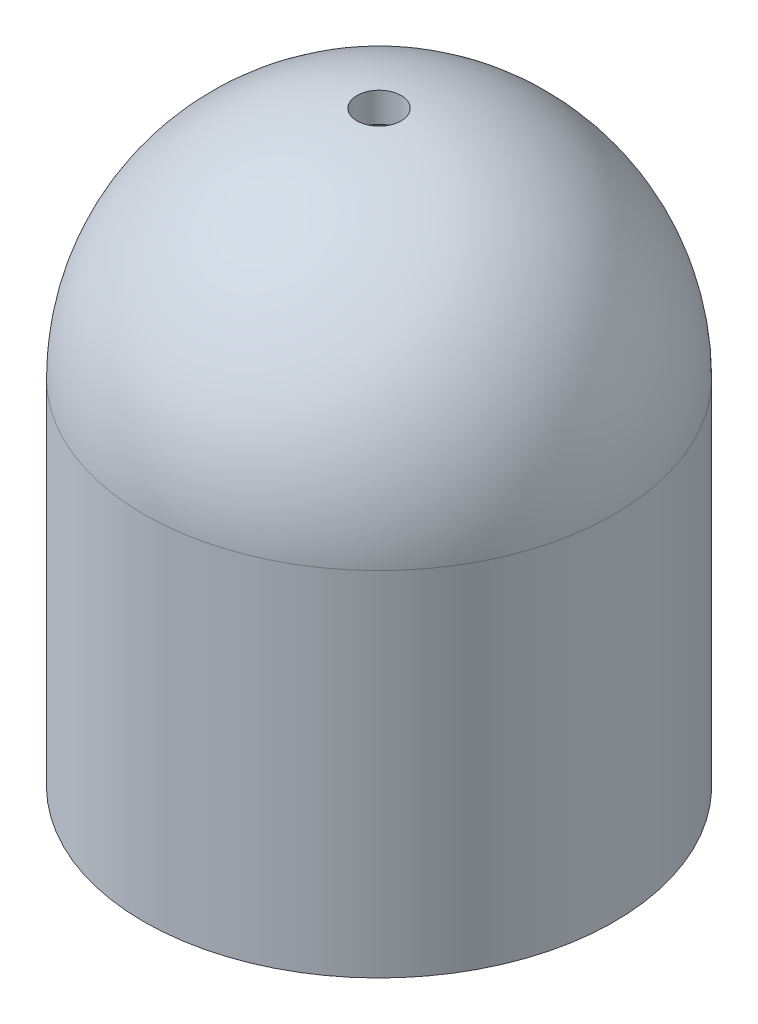
ISO-10303-21;
HEADER;
FILE_DESCRIPTION(('STEP AP214'),'2;1');
FILE_NAME('part.step','',(''),(''),'','','');
FILE_SCHEMA(('AUTOMOTIVE_DESIGN { 1 0 10303 214 1 1 1 1 }'));
ENDSEC;
DATA;
#1=APPLICATION_CONTEXT('core data for automotive mechanical design processes');
#2=APPLICATION_PROTOCOL_DEFINITION('international standard','automotive_design',2000,#1);
#3=PRODUCT_CONTEXT('',#1,'mechanical');
#4=PRODUCT('Part','Part','',(#3));
#5=PRODUCT_RELATED_PRODUCT_CATEGORY('part','',(#4));
#6=PRODUCT_DEFINITION_FORMATION('','',#4);
#7=PRODUCT_DEFINITION_CONTEXT('part definition',#1,'design');
#8=PRODUCT_DEFINITION('design','',#6,#7);
#9=PRODUCT_DEFINITION_SHAPE('','',#8);
#10=(LENGTH_UNIT() NAMED_UNIT(*) SI_UNIT(.MILLI.,.METRE.));
#11=(NAMED_UNIT(*) PLANE_ANGLE_UNIT() SI_UNIT($,.RADIAN.));
#12=(NAMED_UNIT(*) SI_UNIT($,.STERADIAN.) SOLID_ANGLE_UNIT());
#13=UNCERTAINTY_MEASURE_WITH_UNIT(LENGTH_MEASURE(1.E-05),#10,'distance_accuracy_value','');
#14=(GEOMETRIC_REPRESENTATION_CONTEXT(3) GLOBAL_UNCERTAINTY_ASSIGNED_CONTEXT((#13)) GLOBAL_UNIT_ASSIGNED_CONTEXT((#10,
#11,#12)) REPRESENTATION_CONTEXT('',''));
#15=CARTESIAN_POINT('',(0.,0.,0.));
#16=DIRECTION('',(0.,0.,1.));
#17=DIRECTION('',(1.,0.,0.));
#18=AXIS2_PLACEMENT_3D('',#15,#16,#17);
#19=CARTESIAN_POINT('',(44.45,0.,0.));
#20=DIRECTION('',(0.,1.,0.));
#21=DIRECTION('',(-1.,0.,0.));
#22=AXIS2_PLACEMENT_3D('',#19,#20,#21);
#23=SPHERICAL_SURFACE('',#22,44.45);
#24=CARTESIAN_POINT('',(44.45,0.,0.));
#25=DIRECTION('',(0.,1.,0.));
#26=DIRECTION('',(0.,0.,1.));
#27=AXIS2_PLACEMENT_3D('',#24,#25,#26);
#28=CIRCLE('',#27,44.45);
#29=CARTESIAN_POINT('',(44.45,0.,44.45));
#30=VERTEX_POINT('',#29);
#31=EDGE_CURVE('E10',#30,#30,#28,.T.);
#32=ORIENTED_EDGE('',*,*,#31,.F.);
#33=EDGE_LOOP('',(#32));
#34=FACE_BOUND('',#33,.T.);
#35=CARTESIAN_POINT('',(44.45,44.1941296299633,0.));
#36=DIRECTION('',(0.,-1.,0.));
#37=DIRECTION('',(0.,0.,-1.));
#38=AXIS2_PLACEMENT_3D('',#35,#36,#37);
#39=CIRCLE('',#38,4.7625);
#40=CARTESIAN_POINT('',(44.45,44.1941296299633,-4.7625));
#41=VERTEX_POINT('',#40);
#42=EDGE_CURVE('E49',#41,#41,#39,.F.);
#43=ORIENTED_EDGE('',*,*,#42,.T.);
#44=EDGE_LOOP('',(#43));
#45=FACE_BOUND('',#44,.T.);
#46=ADVANCED_FACE('F30',(#34,#45),#23,.F.);
#47=CARTESIAN_POINT('',(44.45,0.,0.));
#48=DIRECTION('',(0.,1.,0.));
#49=DIRECTION('',(1.,0.,0.));
#50=AXIS2_PLACEMENT_3D('',#47,#48,#49);
#51=SPHERICAL_SURFACE('',#50,50.8);
#52=CARTESIAN_POINT('',(44.45,0.,0.));
#53=DIRECTION('',(0.,1.,0.));
#54=DIRECTION('',(0.,0.,1.));
#55=AXIS2_PLACEMENT_3D('',#52,#53,#54);
#56=CIRCLE('',#55,50.8);
#57=CARTESIAN_POINT('',(44.45,0.,50.8));
#58=VERTEX_POINT('',#57);
#59=EDGE_CURVE('E46',#58,#58,#56,.T.);
#60=ORIENTED_EDGE('',*,*,#59,.T.);
#61=EDGE_LOOP('',(#60));
#62=FACE_BOUND('',#61,.T.);
#63=CARTESIAN_POINT('',(44.45,50.5762651225849,0.));
#64=DIRECTION('',(0.,-1.,0.));
#65=DIRECTION('',(0.,0.,-1.));
#66=AXIS2_PLACEMENT_3D('',#63,#64,#65);
#67=CIRCLE('',#66,4.7625);
#68=CARTESIAN_POINT('',(44.45,50.5762651225849,-4.7625));
#69=VERTEX_POINT('',#68);
#70=EDGE_CURVE('E33',#69,#69,#67,.T.);
#71=ORIENTED_EDGE('',*,*,#70,.T.);
#72=EDGE_LOOP('',(#71));
#73=FACE_BOUND('',#72,.T.);
#74=ADVANCED_FACE('F56',(#62,#73),#51,.T.);
#75=CARTESIAN_POINT('',(44.45,50.8,0.));
#76=DIRECTION('',(0.,1.,0.));
#77=DIRECTION('',(0.,0.,1.));
#78=AXIS2_PLACEMENT_3D('',#75,#76,#77);
#79=CYLINDRICAL_SURFACE('',#78,44.45);
#80=ORIENTED_EDGE('',*,*,#31,.T.);
#81=EDGE_LOOP('',(#80));
#82=FACE_BOUND('',#81,.T.);
#83=CARTESIAN_POINT('',(44.45,-76.2,0.));
#84=DIRECTION('',(0.,1.,0.));
#85=DIRECTION('',(0.,0.,1.));
#86=AXIS2_PLACEMENT_3D('',#83,#84,#85);
#87=CIRCLE('',#86,44.45);
#88=CARTESIAN_POINT('',(44.45,-76.2,44.45));
#89=VERTEX_POINT('',#88);
#90=EDGE_CURVE('E37',#89,#89,#87,.T.);
#91=ORIENTED_EDGE('',*,*,#90,.F.);
#92=EDGE_LOOP('',(#91));
#93=FACE_BOUND('',#92,.T.);
#94=ADVANCED_FACE('F77',(#82,#93),#79,.F.);
#95=CARTESIAN_POINT('',(0.,-76.2,0.));
#96=DIRECTION('',(0.,-1.,0.));
#97=DIRECTION('',(0.,0.,-1.));
#98=AXIS2_PLACEMENT_3D('',#95,#96,#97);
#99=PLANE('',#98);
#100=ORIENTED_EDGE('',*,*,#90,.T.);
#101=EDGE_LOOP('',(#100));
#102=FACE_BOUND('',#101,.T.);
#103=CARTESIAN_POINT('',(44.45,-76.2,0.));
#104=DIRECTION('',(0.,1.,0.));
#105=DIRECTION('',(0.,0.,1.));
#106=AXIS2_PLACEMENT_3D('',#103,#104,#105);
#107=CIRCLE('',#106,50.8);
#108=CARTESIAN_POINT('',(44.45,-76.2,50.8));
#109=VERTEX_POINT('',#108);
#110=EDGE_CURVE('E41',#109,#109,#107,.T.);
#111=ORIENTED_EDGE('',*,*,#110,.F.);
#112=EDGE_LOOP('',(#111));
#113=FACE_BOUND('',#112,.T.);
#114=ADVANCED_FACE('F67',(#102,#113),#99,.T.);
#115=CARTESIAN_POINT('',(44.45,50.8,0.));
#116=DIRECTION('',(0.,1.,0.));
#117=DIRECTION('',(0.,0.,1.));
#118=AXIS2_PLACEMENT_3D('',#115,#116,#117);
#119=CYLINDRICAL_SURFACE('',#118,50.8);
#120=ORIENTED_EDGE('',*,*,#110,.T.);
#121=EDGE_LOOP('',(#120));
#122=FACE_BOUND('',#121,.T.);
#123=ORIENTED_EDGE('',*,*,#59,.F.);
#124=EDGE_LOOP('',(#123));
#125=FACE_BOUND('',#124,.T.);
#126=ADVANCED_FACE('F60',(#122,#125),#119,.T.);
#127=CARTESIAN_POINT('',(44.45,54.61,0.));
#128=DIRECTION('',(0.,-1.,0.));
#129=DIRECTION('',(0.,0.,-1.));
#130=AXIS2_PLACEMENT_3D('',#127,#128,#129);
#131=CYLINDRICAL_SURFACE('',#130,4.7625);
#132=CARTESIAN_POINT('',(44.45,44.1941296299633,-4.7625));
#133=CARTESIAN_POINT('',(44.45,44.2606102080115,-4.7625));
#134=CARTESIAN_POINT('',(44.45,44.3270907860596,-4.7625));
#135=CARTESIAN_POINT('',(44.45,44.4600519421559,-4.7625));
#136=CARTESIAN_POINT('',(44.45,44.526532520204,-4.7625));
#137=CARTESIAN_POINT('',(44.45,44.6594936763003,-4.7625));
#138=CARTESIAN_POINT('',(44.45,44.7259742543484,-4.7625));
#139=CARTESIAN_POINT('',(44.45,44.8589354104447,-4.7625));
#140=CARTESIAN_POINT('',(44.45,44.9254159884929,-4.7625));
#141=CARTESIAN_POINT('',(44.45,45.0583771445892,-4.7625));
#142=CARTESIAN_POINT('',(44.45,45.1248577226373,-4.7625));
#143=CARTESIAN_POINT('',(44.45,45.2578188787336,-4.7625));
#144=CARTESIAN_POINT('',(44.45,45.3242994567817,-4.7625));
#145=CARTESIAN_POINT('',(44.45,45.457260612878,-4.7625));
#146=CARTESIAN_POINT('',(44.45,45.5237411909261,-4.7625));
#147=CARTESIAN_POINT('',(44.45,45.6567023470224,-4.7625));
#148=CARTESIAN_POINT('',(44.45,45.7231829250706,-4.7625));
#149=CARTESIAN_POINT('',(44.45,45.8561440811669,-4.7625));
#150=CARTESIAN_POINT('',(44.45,45.922624659215,-4.7625));
#151=CARTESIAN_POINT('',(44.45,46.0555858153113,-4.7625));
#152=CARTESIAN_POINT('',(44.45,46.1220663933594,-4.7625));
#153=CARTESIAN_POINT('',(44.45,46.2550275494557,-4.7625));
#154=CARTESIAN_POINT('',(44.45,46.3215081275038,-4.7625));
#155=CARTESIAN_POINT('',(44.45,46.4544692836001,-4.7625));
#156=CARTESIAN_POINT('',(44.45,46.5209498616483,-4.7625));
#157=CARTESIAN_POINT('',(44.45,46.6539110177446,-4.7625));
#158=CARTESIAN_POINT('',(44.45,46.7203915957927,-4.7625));
#159=CARTESIAN_POINT('',(44.45,46.853352751889,-4.7625));
#160=CARTESIAN_POINT('',(44.45,46.9198333299371,-4.7625));
#161=CARTESIAN_POINT('',(44.45,47.0527944860334,-4.7625));
#162=CARTESIAN_POINT('',(44.45,47.1192750640815,-4.7625));
#163=CARTESIAN_POINT('',(44.45,47.2522362201778,-4.7625));
#164=CARTESIAN_POINT('',(44.45,47.318716798226,-4.7625));
#165=CARTESIAN_POINT('',(44.45,47.4516779543223,-4.7625));
#166=CARTESIAN_POINT('',(44.45,47.5181585323704,-4.7625));
#167=CARTESIAN_POINT('',(44.45,47.6511196884667,-4.7625));
#168=CARTESIAN_POINT('',(44.45,47.7176002665148,-4.7625));
#169=CARTESIAN_POINT('',(44.45,47.8505614226111,-4.7625));
#170=CARTESIAN_POINT('',(44.45,47.9170420006593,-4.7625));
#171=CARTESIAN_POINT('',(44.45,48.0500031567555,-4.7625));
#172=CARTESIAN_POINT('',(44.45,48.1164837348037,-4.7625));
#173=CARTESIAN_POINT('',(44.45,48.2494448909,-4.7625));
#174=CARTESIAN_POINT('',(44.45,48.3159254689481,-4.7625));
#175=CARTESIAN_POINT('',(44.45,48.4488866250444,-4.7625));
#176=CARTESIAN_POINT('',(44.45,48.5153672030925,-4.7625));
#177=CARTESIAN_POINT('',(44.45,48.6483283591888,-4.7625));
#178=CARTESIAN_POINT('',(44.45,48.714808937237,-4.7625));
#179=CARTESIAN_POINT('',(44.45,48.8477700933332,-4.7625));
#180=CARTESIAN_POINT('',(44.45,48.9142506713814,-4.7625));
#181=CARTESIAN_POINT('',(44.45,49.0472118274777,-4.7625));
#182=CARTESIAN_POINT('',(44.45,49.1136924055258,-4.7625));
#183=CARTESIAN_POINT('',(44.45,49.2466535616221,-4.7625));
#184=CARTESIAN_POINT('',(44.45,49.3131341396702,-4.7625));
#185=CARTESIAN_POINT('',(44.45,49.4460952957665,-4.7625));
#186=CARTESIAN_POINT('',(44.45,49.5125758738147,-4.7625));
#187=CARTESIAN_POINT('',(44.45,49.6455370299109,-4.7625));
#188=CARTESIAN_POINT('',(44.45,49.7120176079591,-4.7625));
#189=CARTESIAN_POINT('',(44.45,49.8449787640554,-4.7625));
#190=CARTESIAN_POINT('',(44.45,49.9114593421035,-4.7625));
#191=CARTESIAN_POINT('',(44.45,50.0444204981998,-4.7625));
#192=CARTESIAN_POINT('',(44.45,50.1109010762479,-4.7625));
#193=CARTESIAN_POINT('',(44.45,50.2438622323442,-4.7625));
#194=CARTESIAN_POINT('',(44.45,50.3103428103924,-4.7625));
#195=CARTESIAN_POINT('',(44.45,50.4433039664886,-4.7625));
#196=CARTESIAN_POINT('',(44.45,50.5097845445368,-4.7625));
#197=CARTESIAN_POINT('',(44.45,50.5762651225849,-4.7625));
#198=B_SPLINE_CURVE_WITH_KNOTS('',3,(#132,#133,#134,#135,#136,#137,#138,#139,#140,#141,#142,
#143,#144,#145,#146,#147,#148,#149,#150,#151,#152,#153,#154,#155,#156,#157,#158,#159,#160,#161,
#162,#163,#164,#165,#166,#167,#168,#169,#170,#171,#172,#173,#174,#175,#176,#177,#178,#179,#180,
#181,#182,#183,#184,#185,#186,#187,#188,#189,#190,#191,#192,#193,#194,#195,#196,#197),
.UNSPECIFIED.,.F.,.F.,(4,2,2,2,2,2,2,2,2,2,2,2,2,2,2,2,2,2,2,2,2,2,2,2,2,2,2,2,2,2,2,2,4),(0.,
0.199441734144427,0.398883468288848,0.598325202433275,0.797766936577703,0.99720867072213,
1.19665040486655,1.39609213901098,1.59553387315541,1.79497560729983,1.99441734144425,
2.19385907558868,2.39330080973311,2.59274254387754,2.79218427802196,2.99162601216638,
3.19106774631081,3.39050948045524,3.58995121459967,3.78939294874409,3.98883468288851,
4.18827641703294,4.38771815117737,4.58715988532179,4.78660161946622,4.98604335361064,
5.18548508775507,5.3849268218995,5.58436855604392,5.78381029018835,5.98325202433277,
6.1826937584772,6.38213549262162),.UNSPECIFIED.);
#199=EDGE_CURVE('BSEAM58',#41,#69,#198,.T.);
#200=ORIENTED_EDGE('',*,*,#42,.F.);
#201=ORIENTED_EDGE('',*,*,#70,.F.);
#202=ORIENTED_EDGE('',*,*,#199,.T.);
#203=ORIENTED_EDGE('',*,*,#199,.F.);
#204=EDGE_LOOP('',(#200,#202,#201,#203));
#205=FACE_BOUND('',#204,.T.);
#206=ADVANCED_FACE('F58',(#205),#131,.F.);
#207=CLOSED_SHELL('',(#46,#74,#94,#114,#126,#206));
#208=MANIFOLD_SOLID_BREP('B2',#207);
#209=ADVANCED_BREP_SHAPE_REPRESENTATION('',(#18,#208),#14);
#210=SHAPE_DEFINITION_REPRESENTATION(#9,#209);
ENDSEC;
END-ISO-10303-21;
